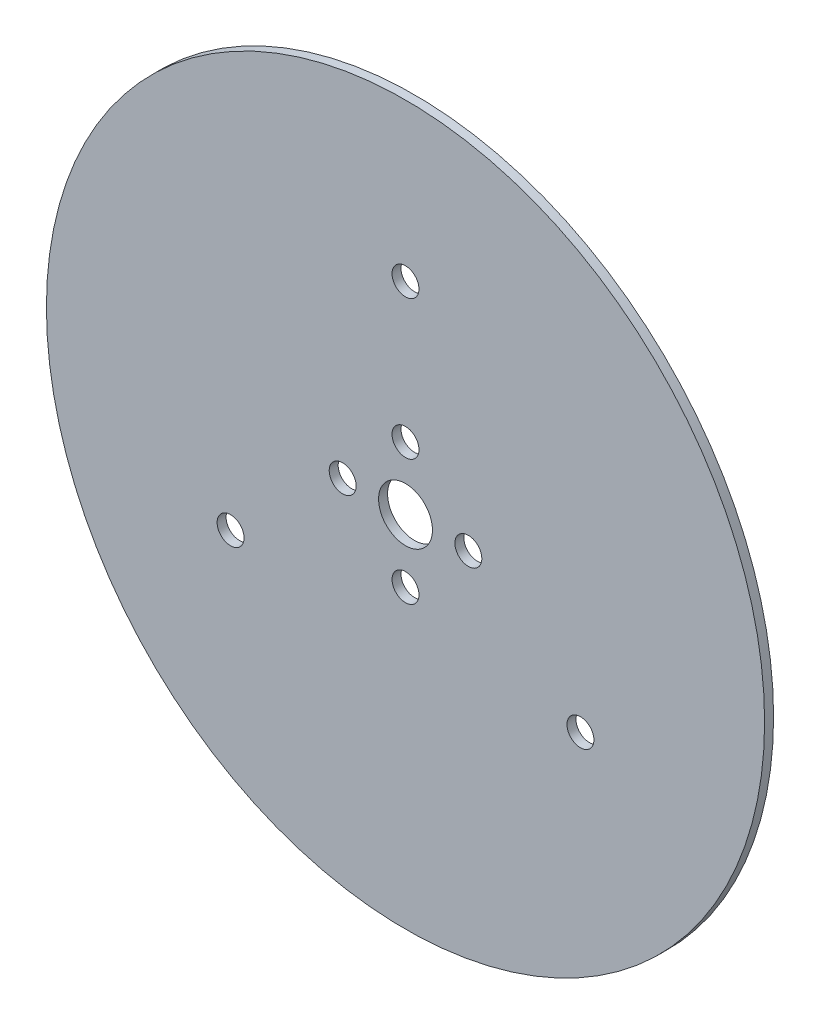
ISO-10303-21;
HEADER;
FILE_DESCRIPTION(('STEP AP214'),'2;1');
FILE_NAME('part.step','',(''),(''),'','','');
FILE_SCHEMA(('AUTOMOTIVE_DESIGN { 1 0 10303 214 1 1 1 1 }'));
ENDSEC;
DATA;
#1=APPLICATION_CONTEXT('core data for automotive mechanical design processes');
#2=APPLICATION_PROTOCOL_DEFINITION('international standard','automotive_design',2000,#1);
#3=PRODUCT_CONTEXT('',#1,'mechanical');
#4=PRODUCT('Part','Part','',(#3));
#5=PRODUCT_RELATED_PRODUCT_CATEGORY('part','',(#4));
#6=PRODUCT_DEFINITION_FORMATION('','',#4);
#7=PRODUCT_DEFINITION_CONTEXT('part definition',#1,'design');
#8=PRODUCT_DEFINITION('design','',#6,#7);
#9=PRODUCT_DEFINITION_SHAPE('','',#8);
#10=(LENGTH_UNIT() NAMED_UNIT(*) SI_UNIT(.MILLI.,.METRE.));
#11=(NAMED_UNIT(*) PLANE_ANGLE_UNIT() SI_UNIT($,.RADIAN.));
#12=(NAMED_UNIT(*) SI_UNIT($,.STERADIAN.) SOLID_ANGLE_UNIT());
#13=UNCERTAINTY_MEASURE_WITH_UNIT(LENGTH_MEASURE(1.E-05),#10,'distance_accuracy_value','');
#14=(GEOMETRIC_REPRESENTATION_CONTEXT(3) GLOBAL_UNCERTAINTY_ASSIGNED_CONTEXT((#13)) GLOBAL_UNIT_ASSIGNED_CONTEXT((#10,
#11,#12)) REPRESENTATION_CONTEXT('',''));
#15=CARTESIAN_POINT('',(0.,0.,0.));
#16=DIRECTION('',(0.,0.,1.));
#17=DIRECTION('',(1.,0.,0.));
#18=AXIS2_PLACEMENT_3D('',#15,#16,#17);
#19=CARTESIAN_POINT('',(0.,7.,1.));
#20=DIRECTION('',(0.,0.,-1.));
#21=DIRECTION('',(-1.,0.,0.));
#22=AXIS2_PLACEMENT_3D('',#19,#20,#21);
#23=CYLINDRICAL_SURFACE('',#22,1.5);
#24=CARTESIAN_POINT('',(0.,7.,1.));
#25=DIRECTION('',(0.,0.,1.));
#26=DIRECTION('',(1.,0.,0.));
#27=AXIS2_PLACEMENT_3D('',#24,#25,#26);
#28=CIRCLE('',#27,1.5);
#29=CARTESIAN_POINT('',(1.5,7.,1.));
#30=VERTEX_POINT('',#29);
#31=EDGE_CURVE('E46',#30,#30,#28,.T.);
#32=ORIENTED_EDGE('',*,*,#31,.T.);
#33=EDGE_LOOP('',(#32));
#34=FACE_BOUND('',#33,.T.);
#35=CARTESIAN_POINT('',(0.,7.,0.));
#36=DIRECTION('',(0.,0.,1.));
#37=DIRECTION('',(1.,0.,0.));
#38=AXIS2_PLACEMENT_3D('',#35,#36,#37);
#39=CIRCLE('',#38,1.5);
#40=CARTESIAN_POINT('',(1.5,7.,0.));
#41=VERTEX_POINT('',#40);
#42=EDGE_CURVE('E65',#41,#41,#39,.T.);
#43=ORIENTED_EDGE('',*,*,#42,.F.);
#44=EDGE_LOOP('',(#43));
#45=FACE_BOUND('',#44,.T.);
#46=ADVANCED_FACE('F38',(#34,#45),#23,.F.);
#47=CARTESIAN_POINT('',(7.,0.,1.));
#48=DIRECTION('',(0.,0.,-1.));
#49=DIRECTION('',(-1.,0.,0.));
#50=AXIS2_PLACEMENT_3D('',#47,#48,#49);
#51=CYLINDRICAL_SURFACE('',#50,1.5);
#52=CARTESIAN_POINT('',(7.,0.,1.));
#53=DIRECTION('',(0.,0.,1.));
#54=DIRECTION('',(1.,0.,0.));
#55=AXIS2_PLACEMENT_3D('',#52,#53,#54);
#56=CIRCLE('',#55,1.5);
#57=CARTESIAN_POINT('',(8.5,0.,1.));
#58=VERTEX_POINT('',#57);
#59=EDGE_CURVE('E51',#58,#58,#56,.T.);
#60=ORIENTED_EDGE('',*,*,#59,.T.);
#61=EDGE_LOOP('',(#60));
#62=FACE_BOUND('',#61,.T.);
#63=CARTESIAN_POINT('',(7.,0.,0.));
#64=DIRECTION('',(0.,0.,1.));
#65=DIRECTION('',(1.,0.,0.));
#66=AXIS2_PLACEMENT_3D('',#63,#64,#65);
#67=CIRCLE('',#66,1.5);
#68=CARTESIAN_POINT('',(8.5,0.,0.));
#69=VERTEX_POINT('',#68);
#70=EDGE_CURVE('E62',#69,#69,#67,.T.);
#71=ORIENTED_EDGE('',*,*,#70,.F.);
#72=EDGE_LOOP('',(#71));
#73=FACE_BOUND('',#72,.T.);
#74=ADVANCED_FACE('F101',(#62,#73),#51,.F.);
#75=CARTESIAN_POINT('',(0.,-7.,1.));
#76=DIRECTION('',(0.,0.,-1.));
#77=DIRECTION('',(-1.,0.,0.));
#78=AXIS2_PLACEMENT_3D('',#75,#76,#77);
#79=CYLINDRICAL_SURFACE('',#78,1.5);
#80=CARTESIAN_POINT('',(0.,-7.,1.));
#81=DIRECTION('',(0.,0.,1.));
#82=DIRECTION('',(1.,0.,0.));
#83=AXIS2_PLACEMENT_3D('',#80,#81,#82);
#84=CIRCLE('',#83,1.5);
#85=CARTESIAN_POINT('',(1.5,-7.,1.));
#86=VERTEX_POINT('',#85);
#87=EDGE_CURVE('E123',#86,#86,#84,.T.);
#88=ORIENTED_EDGE('',*,*,#87,.T.);
#89=EDGE_LOOP('',(#88));
#90=FACE_BOUND('',#89,.T.);
#91=CARTESIAN_POINT('',(0.,-7.,0.));
#92=DIRECTION('',(0.,0.,1.));
#93=DIRECTION('',(1.,0.,0.));
#94=AXIS2_PLACEMENT_3D('',#91,#92,#93);
#95=CIRCLE('',#94,1.5);
#96=CARTESIAN_POINT('',(1.5,-7.,0.));
#97=VERTEX_POINT('',#96);
#98=EDGE_CURVE('E58',#97,#97,#95,.T.);
#99=ORIENTED_EDGE('',*,*,#98,.F.);
#100=EDGE_LOOP('',(#99));
#101=FACE_BOUND('',#100,.T.);
#102=ADVANCED_FACE('F107',(#90,#101),#79,.F.);
#103=CARTESIAN_POINT('',(-7.,0.,1.));
#104=DIRECTION('',(0.,0.,-1.));
#105=DIRECTION('',(-1.,0.,0.));
#106=AXIS2_PLACEMENT_3D('',#103,#104,#105);
#107=CYLINDRICAL_SURFACE('',#106,1.5);
#108=CARTESIAN_POINT('',(-7.,0.,1.));
#109=DIRECTION('',(0.,0.,1.));
#110=DIRECTION('',(1.,0.,0.));
#111=AXIS2_PLACEMENT_3D('',#108,#109,#110);
#112=CIRCLE('',#111,1.5);
#113=CARTESIAN_POINT('',(-5.5,0.,1.));
#114=VERTEX_POINT('',#113);
#115=EDGE_CURVE('E71',#114,#114,#112,.T.);
#116=ORIENTED_EDGE('',*,*,#115,.T.);
#117=EDGE_LOOP('',(#116));
#118=FACE_BOUND('',#117,.T.);
#119=CARTESIAN_POINT('',(-7.,0.,0.));
#120=DIRECTION('',(0.,0.,1.));
#121=DIRECTION('',(1.,0.,0.));
#122=AXIS2_PLACEMENT_3D('',#119,#120,#121);
#123=CIRCLE('',#122,1.5);
#124=CARTESIAN_POINT('',(-5.5,0.,0.));
#125=VERTEX_POINT('',#124);
#126=EDGE_CURVE('E55',#125,#125,#123,.T.);
#127=ORIENTED_EDGE('',*,*,#126,.F.);
#128=EDGE_LOOP('',(#127));
#129=FACE_BOUND('',#128,.T.);
#130=ADVANCED_FACE('F40',(#118,#129),#107,.F.);
#131=CARTESIAN_POINT('',(0.,0.,1.));
#132=DIRECTION('',(0.,0.,-1.));
#133=DIRECTION('',(-1.,0.,0.));
#134=AXIS2_PLACEMENT_3D('',#131,#132,#133);
#135=CYLINDRICAL_SURFACE('',#134,40.);
#136=CARTESIAN_POINT('',(0.,0.,1.));
#137=DIRECTION('',(0.,0.,1.));
#138=DIRECTION('',(1.,0.,0.));
#139=AXIS2_PLACEMENT_3D('',#136,#137,#138);
#140=CIRCLE('',#139,40.);
#141=CARTESIAN_POINT('',(40.,0.,1.));
#142=VERTEX_POINT('',#141);
#143=EDGE_CURVE('E10',#142,#142,#140,.T.);
#144=ORIENTED_EDGE('',*,*,#143,.F.);
#145=EDGE_LOOP('',(#144));
#146=FACE_BOUND('',#145,.T.);
#147=CARTESIAN_POINT('',(0.,0.,0.));
#148=DIRECTION('',(0.,0.,1.));
#149=DIRECTION('',(1.,0.,0.));
#150=AXIS2_PLACEMENT_3D('',#147,#148,#149);
#151=CIRCLE('',#150,40.);
#152=CARTESIAN_POINT('',(40.,0.,0.));
#153=VERTEX_POINT('',#152);
#154=EDGE_CURVE('E68',#153,#153,#151,.T.);
#155=ORIENTED_EDGE('',*,*,#154,.T.);
#156=EDGE_LOOP('',(#155));
#157=FACE_BOUND('',#156,.T.);
#158=ADVANCED_FACE('F112',(#146,#157),#135,.T.);
#159=CARTESIAN_POINT('',(0.,0.,1.));
#160=DIRECTION('',(0.,0.,1.));
#161=DIRECTION('',(1.,0.,0.));
#162=AXIS2_PLACEMENT_3D('',#159,#160,#161);
#163=PLANE('',#162);
#164=CARTESIAN_POINT('',(0.,0.,1.));
#165=DIRECTION('',(0.,0.,1.));
#166=DIRECTION('',(1.,0.,0.));
#167=AXIS2_PLACEMENT_3D('',#164,#165,#166);
#168=CIRCLE('',#167,3.);
#169=CARTESIAN_POINT('',(3.,0.,1.));
#170=VERTEX_POINT('',#169);
#171=EDGE_CURVE('E167',#170,#170,#168,.T.);
#172=ORIENTED_EDGE('',*,*,#171,.F.);
#173=EDGE_LOOP('',(#172));
#174=FACE_BOUND('',#173,.T.);
#175=CARTESIAN_POINT('',(0.,22.5,1.));
#176=DIRECTION('',(0.,0.,1.));
#177=DIRECTION('',(1.,0.,0.));
#178=AXIS2_PLACEMENT_3D('',#175,#176,#177);
#179=CIRCLE('',#178,1.5);
#180=CARTESIAN_POINT('',(1.5,22.5,1.));
#181=VERTEX_POINT('',#180);
#182=EDGE_CURVE('E76',#181,#181,#179,.T.);
#183=ORIENTED_EDGE('',*,*,#182,.F.);
#184=EDGE_LOOP('',(#183));
#185=FACE_BOUND('',#184,.T.);
#186=CARTESIAN_POINT('',(19.4855715851506,-11.2499999999996,1.));
#187=DIRECTION('',(0.,0.,1.));
#188=DIRECTION('',(1.,0.,0.));
#189=AXIS2_PLACEMENT_3D('',#186,#187,#188);
#190=CIRCLE('',#189,1.5);
#191=CARTESIAN_POINT('',(20.9855715851506,-11.2499999999996,1.));
#192=VERTEX_POINT('',#191);
#193=EDGE_CURVE('E162',#192,#192,#190,.T.);
#194=ORIENTED_EDGE('',*,*,#193,.F.);
#195=EDGE_LOOP('',(#194));
#196=FACE_BOUND('',#195,.T.);
#197=CARTESIAN_POINT('',(-19.4855715851492,-11.2500000000004,1.));
#198=DIRECTION('',(0.,0.,1.));
#199=DIRECTION('',(1.,0.,0.));
#200=AXIS2_PLACEMENT_3D('',#197,#198,#199);
#201=CIRCLE('',#200,1.5);
#202=CARTESIAN_POINT('',(-17.9855715851491,-11.2500000000004,1.));
#203=VERTEX_POINT('',#202);
#204=EDGE_CURVE('E155',#203,#203,#201,.T.);
#205=ORIENTED_EDGE('',*,*,#204,.F.);
#206=EDGE_LOOP('',(#205));
#207=FACE_BOUND('',#206,.T.);
#208=ORIENTED_EDGE('',*,*,#115,.F.);
#209=EDGE_LOOP('',(#208));
#210=FACE_BOUND('',#209,.T.);
#211=ORIENTED_EDGE('',*,*,#87,.F.);
#212=EDGE_LOOP('',(#211));
#213=FACE_BOUND('',#212,.T.);
#214=ORIENTED_EDGE('',*,*,#59,.F.);
#215=EDGE_LOOP('',(#214));
#216=FACE_BOUND('',#215,.T.);
#217=ORIENTED_EDGE('',*,*,#31,.F.);
#218=EDGE_LOOP('',(#217));
#219=FACE_BOUND('',#218,.T.);
#220=ORIENTED_EDGE('',*,*,#143,.T.);
#221=EDGE_LOOP('',(#220));
#222=FACE_BOUND('',#221,.T.);
#223=ADVANCED_FACE('F128',(#174,#185,#196,#207,#210,#213,#216,#219,#222),#163,.T.);
#224=CARTESIAN_POINT('',(0.,0.,0.));
#225=DIRECTION('',(0.,0.,1.));
#226=DIRECTION('',(1.,0.,0.));
#227=AXIS2_PLACEMENT_3D('',#224,#225,#226);
#228=PLANE('',#227);
#229=CARTESIAN_POINT('',(0.,0.,0.));
#230=DIRECTION('',(0.,0.,1.));
#231=DIRECTION('',(1.,0.,0.));
#232=AXIS2_PLACEMENT_3D('',#229,#230,#231);
#233=CIRCLE('',#232,3.);
#234=CARTESIAN_POINT('',(3.,0.,0.));
#235=VERTEX_POINT('',#234);
#236=EDGE_CURVE('E42',#235,#235,#233,.T.);
#237=ORIENTED_EDGE('',*,*,#236,.T.);
#238=EDGE_LOOP('',(#237));
#239=FACE_BOUND('',#238,.T.);
#240=CARTESIAN_POINT('',(0.,22.5,0.));
#241=DIRECTION('',(0.,0.,1.));
#242=DIRECTION('',(1.,0.,0.));
#243=AXIS2_PLACEMENT_3D('',#240,#241,#242);
#244=CIRCLE('',#243,1.5);
#245=CARTESIAN_POINT('',(1.5,22.5,0.));
#246=VERTEX_POINT('',#245);
#247=EDGE_CURVE('E59',#246,#246,#244,.T.);
#248=ORIENTED_EDGE('',*,*,#247,.T.);
#249=EDGE_LOOP('',(#248));
#250=FACE_BOUND('',#249,.T.);
#251=CARTESIAN_POINT('',(19.4855715851506,-11.2499999999996,0.));
#252=DIRECTION('',(0.,0.,1.));
#253=DIRECTION('',(1.,0.,0.));
#254=AXIS2_PLACEMENT_3D('',#251,#252,#253);
#255=CIRCLE('',#254,1.5);
#256=CARTESIAN_POINT('',(20.9855715851506,-11.2499999999996,0.));
#257=VERTEX_POINT('',#256);
#258=EDGE_CURVE('E75',#257,#257,#255,.T.);
#259=ORIENTED_EDGE('',*,*,#258,.T.);
#260=EDGE_LOOP('',(#259));
#261=FACE_BOUND('',#260,.T.);
#262=CARTESIAN_POINT('',(-19.4855715851492,-11.2500000000004,0.));
#263=DIRECTION('',(0.,0.,1.));
#264=DIRECTION('',(1.,0.,0.));
#265=AXIS2_PLACEMENT_3D('',#262,#263,#264);
#266=CIRCLE('',#265,1.5);
#267=CARTESIAN_POINT('',(-17.9855715851491,-11.2500000000004,0.));
#268=VERTEX_POINT('',#267);
#269=EDGE_CURVE('E72',#268,#268,#266,.T.);
#270=ORIENTED_EDGE('',*,*,#269,.T.);
#271=EDGE_LOOP('',(#270));
#272=FACE_BOUND('',#271,.T.);
#273=ORIENTED_EDGE('',*,*,#126,.T.);
#274=EDGE_LOOP('',(#273));
#275=FACE_BOUND('',#274,.T.);
#276=ORIENTED_EDGE('',*,*,#98,.T.);
#277=EDGE_LOOP('',(#276));
#278=FACE_BOUND('',#277,.T.);
#279=ORIENTED_EDGE('',*,*,#70,.T.);
#280=EDGE_LOOP('',(#279));
#281=FACE_BOUND('',#280,.T.);
#282=ORIENTED_EDGE('',*,*,#42,.T.);
#283=EDGE_LOOP('',(#282));
#284=FACE_BOUND('',#283,.T.);
#285=ORIENTED_EDGE('',*,*,#154,.F.);
#286=EDGE_LOOP('',(#285));
#287=FACE_BOUND('',#286,.T.);
#288=ADVANCED_FACE('F81',(#239,#250,#261,#272,#275,#278,#281,#284,#287),#228,.F.);
#289=CARTESIAN_POINT('',(-19.4855715851492,-11.2500000000004,-9.));
#290=DIRECTION('',(0.,0.,1.));
#291=DIRECTION('',(1.,0.,0.));
#292=AXIS2_PLACEMENT_3D('',#289,#290,#291);
#293=CYLINDRICAL_SURFACE('',#292,1.5);
#294=ORIENTED_EDGE('',*,*,#204,.T.);
#295=EDGE_LOOP('',(#294));
#296=FACE_BOUND('',#295,.T.);
#297=ORIENTED_EDGE('',*,*,#269,.F.);
#298=EDGE_LOOP('',(#297));
#299=FACE_BOUND('',#298,.T.);
#300=ADVANCED_FACE('F96',(#296,#299),#293,.F.);
#301=CARTESIAN_POINT('',(19.4855715851506,-11.2499999999996,-9.));
#302=DIRECTION('',(0.,0.,1.));
#303=DIRECTION('',(1.,0.,0.));
#304=AXIS2_PLACEMENT_3D('',#301,#302,#303);
#305=CYLINDRICAL_SURFACE('',#304,1.5);
#306=ORIENTED_EDGE('',*,*,#193,.T.);
#307=EDGE_LOOP('',(#306));
#308=FACE_BOUND('',#307,.T.);
#309=ORIENTED_EDGE('',*,*,#258,.F.);
#310=EDGE_LOOP('',(#309));
#311=FACE_BOUND('',#310,.T.);
#312=ADVANCED_FACE('F87',(#308,#311),#305,.F.);
#313=CARTESIAN_POINT('',(0.,22.5,-9.));
#314=DIRECTION('',(0.,0.,1.));
#315=DIRECTION('',(1.,0.,0.));
#316=AXIS2_PLACEMENT_3D('',#313,#314,#315);
#317=CYLINDRICAL_SURFACE('',#316,1.5);
#318=ORIENTED_EDGE('',*,*,#182,.T.);
#319=EDGE_LOOP('',(#318));
#320=FACE_BOUND('',#319,.T.);
#321=ORIENTED_EDGE('',*,*,#247,.F.);
#322=EDGE_LOOP('',(#321));
#323=FACE_BOUND('',#322,.T.);
#324=ADVANCED_FACE('F84',(#320,#323),#317,.F.);
#325=CARTESIAN_POINT('',(0.,0.,-9.));
#326=DIRECTION('',(0.,0.,1.));
#327=DIRECTION('',(1.,0.,0.));
#328=AXIS2_PLACEMENT_3D('',#325,#326,#327);
#329=CYLINDRICAL_SURFACE('',#328,3.);
#330=ORIENTED_EDGE('',*,*,#171,.T.);
#331=EDGE_LOOP('',(#330));
#332=FACE_BOUND('',#331,.T.);
#333=ORIENTED_EDGE('',*,*,#236,.F.);
#334=EDGE_LOOP('',(#333));
#335=FACE_BOUND('',#334,.T.);
#336=ADVANCED_FACE('F86',(#332,#335),#329,.F.);
#337=CLOSED_SHELL('',(#46,#74,#102,#130,#158,#223,#288,#300,#312,#324,#336));
#338=MANIFOLD_SOLID_BREP('B2',#337);
#339=ADVANCED_BREP_SHAPE_REPRESENTATION('',(#18,#338),#14);
#340=SHAPE_DEFINITION_REPRESENTATION(#9,#339);
ENDSEC;
END-ISO-10303-21;
